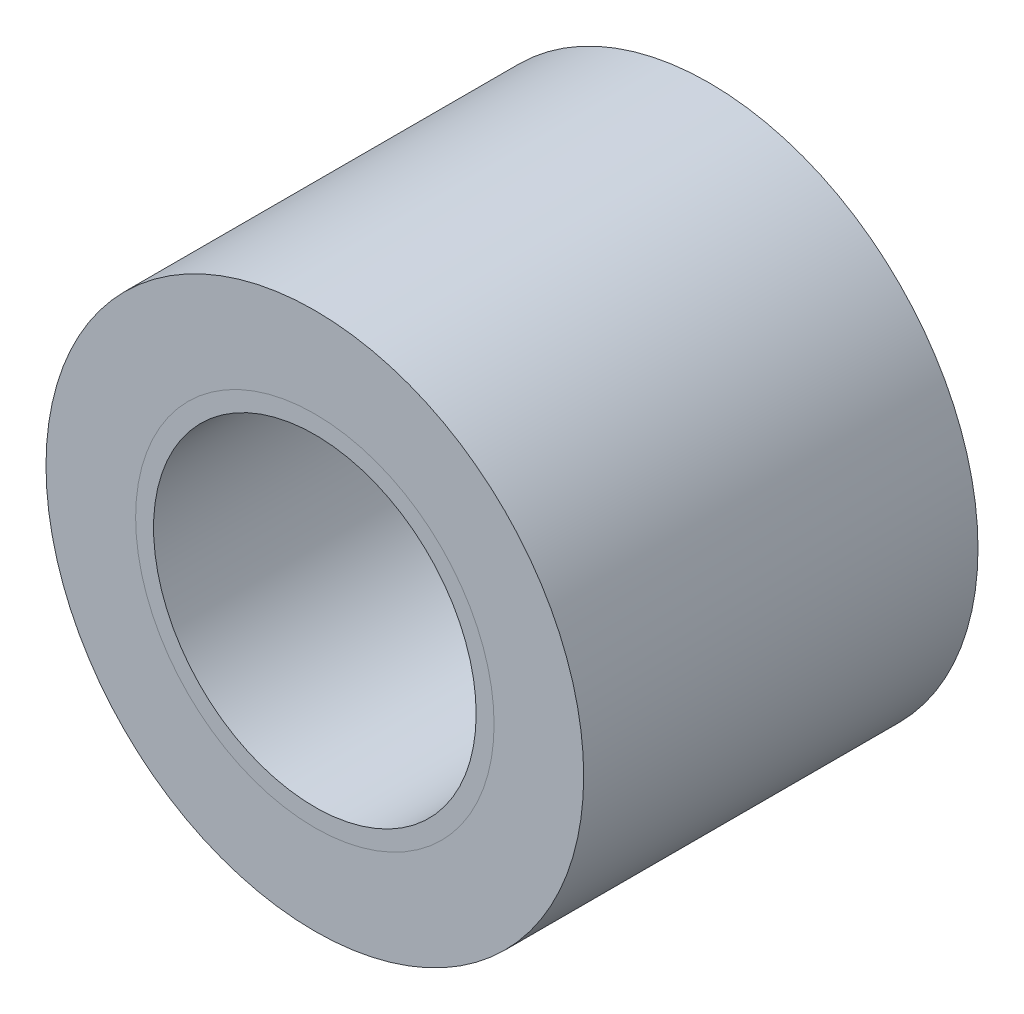
ISO-10303-21;
HEADER;
FILE_DESCRIPTION(('STEP AP214'),'2;1');
FILE_NAME('part.step','',(''),(''),'','','');
FILE_SCHEMA(('AUTOMOTIVE_DESIGN { 1 0 10303 214 1 1 1 1 }'));
ENDSEC;
DATA;
#1=APPLICATION_CONTEXT('core data for automotive mechanical design processes');
#2=APPLICATION_PROTOCOL_DEFINITION('international standard','automotive_design',2000,#1);
#3=PRODUCT_CONTEXT('',#1,'mechanical');
#4=PRODUCT('Part','Part','',(#3));
#5=PRODUCT_RELATED_PRODUCT_CATEGORY('part','',(#4));
#6=PRODUCT_DEFINITION_FORMATION('','',#4);
#7=PRODUCT_DEFINITION_CONTEXT('part definition',#1,'design');
#8=PRODUCT_DEFINITION('design','',#6,#7);
#9=PRODUCT_DEFINITION_SHAPE('','',#8);
#10=(LENGTH_UNIT() NAMED_UNIT(*) SI_UNIT(.MILLI.,.METRE.));
#11=(NAMED_UNIT(*) PLANE_ANGLE_UNIT() SI_UNIT($,.RADIAN.));
#12=(NAMED_UNIT(*) SI_UNIT($,.STERADIAN.) SOLID_ANGLE_UNIT());
#13=UNCERTAINTY_MEASURE_WITH_UNIT(LENGTH_MEASURE(1.E-05),#10,'distance_accuracy_value','');
#14=(GEOMETRIC_REPRESENTATION_CONTEXT(3) GLOBAL_UNCERTAINTY_ASSIGNED_CONTEXT((#13)) GLOBAL_UNIT_ASSIGNED_CONTEXT((#10,
#11,#12)) REPRESENTATION_CONTEXT('',''));
#15=CARTESIAN_POINT('',(0.,0.,0.));
#16=DIRECTION('',(0.,0.,1.));
#17=DIRECTION('',(1.,0.,0.));
#18=AXIS2_PLACEMENT_3D('',#15,#16,#17);
#19=CARTESIAN_POINT('',(0.,0.,7.5));
#20=DIRECTION('',(0.,0.,-1.));
#21=DIRECTION('',(-1.,0.,0.));
#22=AXIS2_PLACEMENT_3D('',#19,#20,#21);
#23=CYLINDRICAL_SURFACE('',#22,9.);
#24=CARTESIAN_POINT('',(0.,0.,7.5));
#25=DIRECTION('',(0.,0.,1.));
#26=DIRECTION('',(1.,0.,0.));
#27=AXIS2_PLACEMENT_3D('',#24,#25,#26);
#28=CIRCLE('',#27,9.);
#29=CARTESIAN_POINT('',(9.,0.,7.5));
#30=VERTEX_POINT('',#29);
#31=EDGE_CURVE('E12',#30,#30,#28,.T.);
#32=ORIENTED_EDGE('',*,*,#31,.F.);
#33=EDGE_LOOP('',(#32));
#34=FACE_BOUND('',#33,.T.);
#35=CARTESIAN_POINT('',(0.,0.,0.));
#36=DIRECTION('',(0.,0.,1.));
#37=DIRECTION('',(1.,0.,0.));
#38=AXIS2_PLACEMENT_3D('',#35,#36,#37);
#39=CIRCLE('',#38,9.);
#40=CARTESIAN_POINT('',(9.,0.,0.));
#41=VERTEX_POINT('',#40);
#42=EDGE_CURVE('E55',#41,#41,#39,.T.);
#43=ORIENTED_EDGE('',*,*,#42,.T.);
#44=EDGE_LOOP('',(#43));
#45=FACE_BOUND('',#44,.T.);
#46=ADVANCED_FACE('F52',(#34,#45),#23,.T.);
#47=CARTESIAN_POINT('',(0.,0.,7.5));
#48=DIRECTION('',(0.,0.,1.));
#49=DIRECTION('',(1.,0.,0.));
#50=AXIS2_PLACEMENT_3D('',#47,#48,#49);
#51=PLANE('',#50);
#52=CARTESIAN_POINT('',(0.,0.,7.5));
#53=DIRECTION('',(0.,0.,1.));
#54=DIRECTION('',(1.,0.,0.));
#55=AXIS2_PLACEMENT_3D('',#52,#53,#54);
#56=CIRCLE('',#55,1.5);
#57=CARTESIAN_POINT('',(1.5,0.,7.5));
#58=VERTEX_POINT('',#57);
#59=EDGE_CURVE('E62',#58,#58,#56,.T.);
#60=ORIENTED_EDGE('',*,*,#59,.F.);
#61=EDGE_LOOP('',(#60));
#62=FACE_BOUND('',#61,.T.);
#63=ORIENTED_EDGE('',*,*,#31,.T.);
#64=EDGE_LOOP('',(#63));
#65=FACE_BOUND('',#64,.T.);
#66=ADVANCED_FACE('F75',(#62,#65),#51,.T.);
#67=CARTESIAN_POINT('',(0.,0.,0.));
#68=DIRECTION('',(0.,0.,1.));
#69=DIRECTION('',(1.,0.,0.));
#70=AXIS2_PLACEMENT_3D('',#67,#68,#69);
#71=PLANE('',#70);
#72=CARTESIAN_POINT('',(0.,0.,0.));
#73=DIRECTION('',(0.,0.,-1.));
#74=DIRECTION('',(-1.,0.,0.));
#75=AXIS2_PLACEMENT_3D('',#72,#73,#74);
#76=CIRCLE('',#75,1.5);
#77=CARTESIAN_POINT('',(-1.5,0.,0.));
#78=VERTEX_POINT('',#77);
#79=EDGE_CURVE('E66',#78,#78,#76,.T.);
#80=ORIENTED_EDGE('',*,*,#79,.F.);
#81=EDGE_LOOP('',(#80));
#82=FACE_BOUND('',#81,.T.);
#83=ORIENTED_EDGE('',*,*,#42,.F.);
#84=EDGE_LOOP('',(#83));
#85=FACE_BOUND('',#84,.T.);
#86=ADVANCED_FACE('F72',(#82,#85),#71,.F.);
#87=CARTESIAN_POINT('',(0.,0.,22.));
#88=DIRECTION('',(0.,0.,-1.));
#89=DIRECTION('',(-1.,0.,0.));
#90=AXIS2_PLACEMENT_3D('',#87,#88,#89);
#91=CYLINDRICAL_SURFACE('',#90,1.5);
#92=ORIENTED_EDGE('',*,*,#59,.T.);
#93=EDGE_LOOP('',(#92));
#94=FACE_BOUND('',#93,.T.);
#95=ORIENTED_EDGE('',*,*,#79,.T.);
#96=EDGE_LOOP('',(#95));
#97=FACE_BOUND('',#96,.T.);
#98=ADVANCED_FACE('F70',(#94,#97),#91,.F.);
#99=CLOSED_SHELL('',(#46,#66,#86,#98));
#100=MANIFOLD_SOLID_BREP('B2',#99);
#101=CARTESIAN_POINT('',(0.,0.,22.));
#102=DIRECTION('',(0.,0.,1.));
#103=DIRECTION('',(1.,0.,0.));
#104=AXIS2_PLACEMENT_3D('',#101,#102,#103);
#105=PLANE('',#104);
#106=CARTESIAN_POINT('',(0.,0.,22.));
#107=DIRECTION('',(0.,0.,1.));
#108=DIRECTION('',(1.,0.,0.));
#109=AXIS2_PLACEMENT_3D('',#106,#107,#108);
#110=CIRCLE('',#109,10.);
#111=CARTESIAN_POINT('',(10.,0.,22.));
#112=VERTEX_POINT('',#111);
#113=EDGE_CURVE('E51',#112,#112,#110,.T.);
#114=ORIENTED_EDGE('',*,*,#113,.T.);
#115=EDGE_LOOP('',(#114));
#116=FACE_BOUND('',#115,.T.);
#117=CARTESIAN_POINT('',(0.,0.,22.));
#118=DIRECTION('',(0.,0.,1.));
#119=DIRECTION('',(1.,0.,0.));
#120=AXIS2_PLACEMENT_3D('',#117,#118,#119);
#121=CIRCLE('',#120,9.);
#122=CARTESIAN_POINT('',(9.,0.,22.));
#123=VERTEX_POINT('',#122);
#124=EDGE_CURVE('E132',#123,#123,#121,.T.);
#125=ORIENTED_EDGE('',*,*,#124,.F.);
#126=EDGE_LOOP('',(#125));
#127=FACE_BOUND('',#126,.T.);
#128=ADVANCED_FACE('F121',(#116,#127),#105,.T.);
#129=CARTESIAN_POINT('',(0.,0.,0.));
#130=DIRECTION('',(0.,0.,1.));
#131=DIRECTION('',(1.,0.,0.));
#132=AXIS2_PLACEMENT_3D('',#129,#130,#131);
#133=PLANE('',#132);
#134=CARTESIAN_POINT('',(0.,0.,0.));
#135=DIRECTION('',(0.,0.,1.));
#136=DIRECTION('',(1.,0.,0.));
#137=AXIS2_PLACEMENT_3D('',#134,#135,#136);
#138=CIRCLE('',#137,10.);
#139=CARTESIAN_POINT('',(10.,0.,0.));
#140=VERTEX_POINT('',#139);
#141=EDGE_CURVE('E125',#140,#140,#138,.T.);
#142=ORIENTED_EDGE('',*,*,#141,.F.);
#143=EDGE_LOOP('',(#142));
#144=FACE_BOUND('',#143,.T.);
#145=CARTESIAN_POINT('',(0.,0.,0.));
#146=DIRECTION('',(0.,0.,1.));
#147=DIRECTION('',(1.,0.,0.));
#148=AXIS2_PLACEMENT_3D('',#145,#146,#147);
#149=CIRCLE('',#148,9.);
#150=CARTESIAN_POINT('',(9.,0.,0.));
#151=VERTEX_POINT('',#150);
#152=EDGE_CURVE('E134',#151,#151,#149,.T.);
#153=ORIENTED_EDGE('',*,*,#152,.T.);
#154=EDGE_LOOP('',(#153));
#155=FACE_BOUND('',#154,.T.);
#156=ADVANCED_FACE('F144',(#144,#155),#133,.F.);
#157=CARTESIAN_POINT('',(0.,0.,22.));
#158=DIRECTION('',(0.,0.,-1.));
#159=DIRECTION('',(-1.,0.,0.));
#160=AXIS2_PLACEMENT_3D('',#157,#158,#159);
#161=CYLINDRICAL_SURFACE('',#160,10.);
#162=ORIENTED_EDGE('',*,*,#113,.F.);
#163=EDGE_LOOP('',(#162));
#164=FACE_BOUND('',#163,.T.);
#165=ORIENTED_EDGE('',*,*,#141,.T.);
#166=EDGE_LOOP('',(#165));
#167=FACE_BOUND('',#166,.T.);
#168=ADVANCED_FACE('F123',(#164,#167),#161,.T.);
#169=CARTESIAN_POINT('',(0.,0.,22.));
#170=DIRECTION('',(0.,0.,-1.));
#171=DIRECTION('',(-1.,0.,0.));
#172=AXIS2_PLACEMENT_3D('',#169,#170,#171);
#173=CYLINDRICAL_SURFACE('',#172,9.);
#174=ORIENTED_EDGE('',*,*,#124,.T.);
#175=EDGE_LOOP('',(#174));
#176=FACE_BOUND('',#175,.T.);
#177=ORIENTED_EDGE('',*,*,#152,.F.);
#178=EDGE_LOOP('',(#177));
#179=FACE_BOUND('',#178,.T.);
#180=ADVANCED_FACE('F140',(#176,#179),#173,.F.);
#181=CLOSED_SHELL('',(#128,#156,#168,#180));
#182=MANIFOLD_SOLID_BREP('B7',#181);
#183=CARTESIAN_POINT('',(0.,0.,22.));
#184=DIRECTION('',(0.,0.,-1.));
#185=DIRECTION('',(-1.,0.,0.));
#186=AXIS2_PLACEMENT_3D('',#183,#184,#185);
#187=CYLINDRICAL_SURFACE('',#186,10.);
#188=CARTESIAN_POINT('',(0.,0.,22.));
#189=DIRECTION('',(0.,0.,1.));
#190=DIRECTION('',(1.,0.,0.));
#191=AXIS2_PLACEMENT_3D('',#188,#189,#190);
#192=CIRCLE('',#191,10.);
#193=CARTESIAN_POINT('',(10.,0.,22.));
#194=VERTEX_POINT('',#193);
#195=EDGE_CURVE('E191',#194,#194,#192,.T.);
#196=ORIENTED_EDGE('',*,*,#195,.T.);
#197=EDGE_LOOP('',(#196));
#198=FACE_BOUND('',#197,.T.);
#199=CARTESIAN_POINT('',(0.,0.,0.));
#200=DIRECTION('',(0.,0.,1.));
#201=DIRECTION('',(1.,0.,0.));
#202=AXIS2_PLACEMENT_3D('',#199,#200,#201);
#203=CIRCLE('',#202,10.);
#204=CARTESIAN_POINT('',(10.,0.,0.));
#205=VERTEX_POINT('',#204);
#206=EDGE_CURVE('E198',#205,#205,#203,.T.);
#207=ORIENTED_EDGE('',*,*,#206,.F.);
#208=EDGE_LOOP('',(#207));
#209=FACE_BOUND('',#208,.T.);
#210=ADVANCED_FACE('F183',(#198,#209),#187,.F.);
#211=CARTESIAN_POINT('',(0.,0.,22.));
#212=DIRECTION('',(0.,0.,-1.));
#213=DIRECTION('',(-1.,0.,0.));
#214=AXIS2_PLACEMENT_3D('',#211,#212,#213);
#215=CYLINDRICAL_SURFACE('',#214,15.);
#216=CARTESIAN_POINT('',(0.,0.,22.));
#217=DIRECTION('',(0.,0.,1.));
#218=DIRECTION('',(1.,0.,0.));
#219=AXIS2_PLACEMENT_3D('',#216,#217,#218);
#220=CIRCLE('',#219,15.);
#221=CARTESIAN_POINT('',(15.,0.,22.));
#222=VERTEX_POINT('',#221);
#223=EDGE_CURVE('E120',#222,#222,#220,.T.);
#224=ORIENTED_EDGE('',*,*,#223,.F.);
#225=EDGE_LOOP('',(#224));
#226=FACE_BOUND('',#225,.T.);
#227=CARTESIAN_POINT('',(0.,0.,0.));
#228=DIRECTION('',(0.,0.,1.));
#229=DIRECTION('',(1.,0.,0.));
#230=AXIS2_PLACEMENT_3D('',#227,#228,#229);
#231=CIRCLE('',#230,15.);
#232=CARTESIAN_POINT('',(15.,0.,0.));
#233=VERTEX_POINT('',#232);
#234=EDGE_CURVE('E186',#233,#233,#231,.T.);
#235=ORIENTED_EDGE('',*,*,#234,.T.);
#236=EDGE_LOOP('',(#235));
#237=FACE_BOUND('',#236,.T.);
#238=ADVANCED_FACE('F207',(#226,#237),#215,.T.);
#239=CARTESIAN_POINT('',(0.,0.,22.));
#240=DIRECTION('',(0.,0.,1.));
#241=DIRECTION('',(1.,0.,0.));
#242=AXIS2_PLACEMENT_3D('',#239,#240,#241);
#243=PLANE('',#242);
#244=ORIENTED_EDGE('',*,*,#195,.F.);
#245=EDGE_LOOP('',(#244));
#246=FACE_BOUND('',#245,.T.);
#247=ORIENTED_EDGE('',*,*,#223,.T.);
#248=EDGE_LOOP('',(#247));
#249=FACE_BOUND('',#248,.T.);
#250=ADVANCED_FACE('F211',(#246,#249),#243,.T.);
#251=CARTESIAN_POINT('',(0.,0.,0.));
#252=DIRECTION('',(0.,0.,1.));
#253=DIRECTION('',(1.,0.,0.));
#254=AXIS2_PLACEMENT_3D('',#251,#252,#253);
#255=PLANE('',#254);
#256=ORIENTED_EDGE('',*,*,#206,.T.);
#257=EDGE_LOOP('',(#256));
#258=FACE_BOUND('',#257,.T.);
#259=ORIENTED_EDGE('',*,*,#234,.F.);
#260=EDGE_LOOP('',(#259));
#261=FACE_BOUND('',#260,.T.);
#262=ADVANCED_FACE('F209',(#258,#261),#255,.F.);
#263=CLOSED_SHELL('',(#210,#238,#250,#262));
#264=MANIFOLD_SOLID_BREP('B46',#263);
#265=ADVANCED_BREP_SHAPE_REPRESENTATION('',(#18,#100,#182,#264),#14);
#266=SHAPE_DEFINITION_REPRESENTATION(#9,#265);
ENDSEC;
END-ISO-10303-21;
